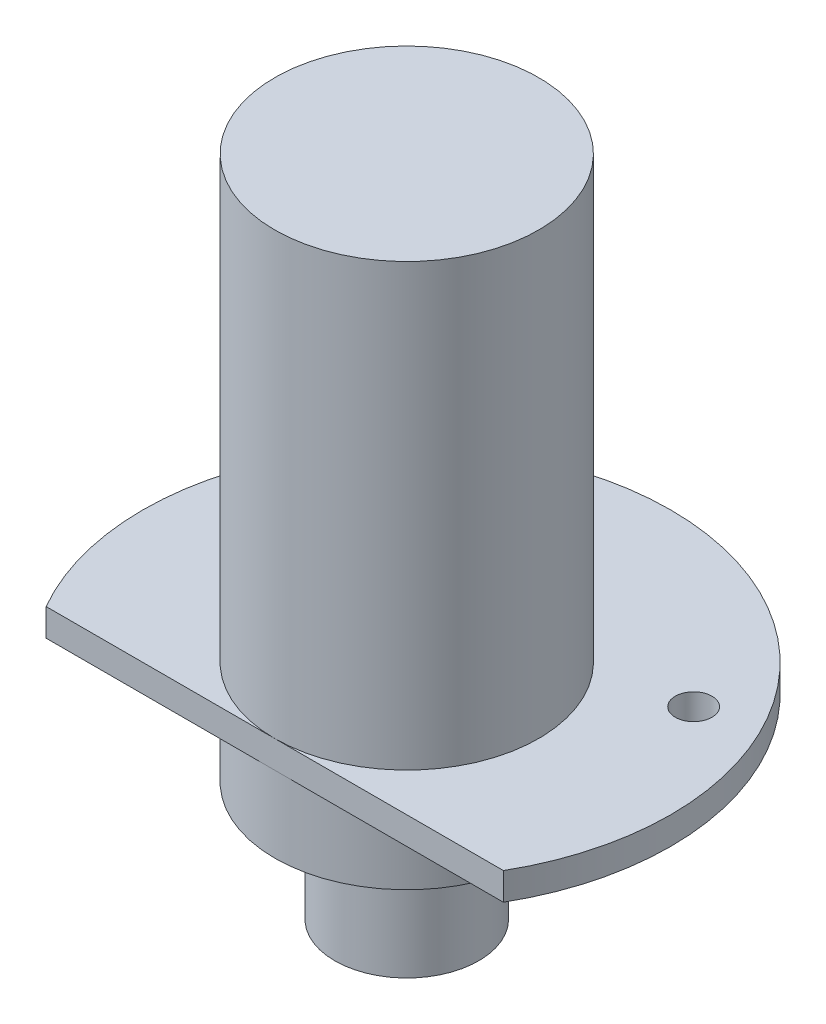
ISO-10303-21;
HEADER;
FILE_DESCRIPTION(('STEP AP214'),'2;1');
FILE_NAME('part.step','',(''),(''),'','','');
FILE_SCHEMA(('AUTOMOTIVE_DESIGN { 1 0 10303 214 1 1 1 1 }'));
ENDSEC;
DATA;
#1=APPLICATION_CONTEXT('core data for automotive mechanical design processes');
#2=APPLICATION_PROTOCOL_DEFINITION('international standard','automotive_design',2000,#1);
#3=PRODUCT_CONTEXT('',#1,'mechanical');
#4=PRODUCT('Part','Part','',(#3));
#5=PRODUCT_RELATED_PRODUCT_CATEGORY('part','',(#4));
#6=PRODUCT_DEFINITION_FORMATION('','',#4);
#7=PRODUCT_DEFINITION_CONTEXT('part definition',#1,'design');
#8=PRODUCT_DEFINITION('design','',#6,#7);
#9=PRODUCT_DEFINITION_SHAPE('','',#8);
#10=(LENGTH_UNIT() NAMED_UNIT(*) SI_UNIT(.MILLI.,.METRE.));
#11=(NAMED_UNIT(*) PLANE_ANGLE_UNIT() SI_UNIT($,.RADIAN.));
#12=(NAMED_UNIT(*) SI_UNIT($,.STERADIAN.) SOLID_ANGLE_UNIT());
#13=UNCERTAINTY_MEASURE_WITH_UNIT(LENGTH_MEASURE(1.E-05),#10,'distance_accuracy_value','');
#14=(GEOMETRIC_REPRESENTATION_CONTEXT(3) GLOBAL_UNCERTAINTY_ASSIGNED_CONTEXT((#13)) GLOBAL_UNIT_ASSIGNED_CONTEXT((#10,
#11,#12)) REPRESENTATION_CONTEXT('',''));
#15=CARTESIAN_POINT('',(0.,0.,0.));
#16=DIRECTION('',(0.,0.,1.));
#17=DIRECTION('',(1.,0.,0.));
#18=AXIS2_PLACEMENT_3D('',#15,#16,#17);
#19=CARTESIAN_POINT('',(0.,55.245,-10.999999971));
#20=DIRECTION('',(0.,-1.,0.));
#21=DIRECTION('',(0.,0.,-1.));
#22=AXIS2_PLACEMENT_3D('',#19,#20,#21);
#23=PLANE('',#22);
#24=CARTESIAN_POINT('',(0.,55.245,0.));
#25=DIRECTION('',(0.,1.,0.));
#26=DIRECTION('',(0.,0.,1.));
#27=AXIS2_PLACEMENT_3D('',#24,#25,#26);
#28=CIRCLE('',#27,10.999999971);
#29=CARTESIAN_POINT('',(0.,55.245,10.999999971));
#30=VERTEX_POINT('',#29);
#31=EDGE_CURVE('E11',#30,#30,#28,.T.);
#32=ORIENTED_EDGE('',*,*,#31,.T.);
#33=EDGE_LOOP('',(#32));
#34=FACE_BOUND('',#33,.T.);
#35=ADVANCED_FACE('F35',(#34),#23,.F.);
#36=CARTESIAN_POINT('',(0.,55.245,0.));
#37=DIRECTION('',(0.,1.,0.));
#38=DIRECTION('',(0.,0.,1.));
#39=AXIS2_PLACEMENT_3D('',#36,#37,#38);
#40=CYLINDRICAL_SURFACE('',#39,10.999999971);
#41=ORIENTED_EDGE('',*,*,#31,.F.);
#42=EDGE_LOOP('',(#41));
#43=FACE_BOUND('',#42,.T.);
#44=CARTESIAN_POINT('',(0.,18.542,0.));
#45=DIRECTION('',(0.,1.,0.));
#46=DIRECTION('',(0.,0.,1.));
#47=AXIS2_PLACEMENT_3D('',#44,#45,#46);
#48=CIRCLE('',#47,10.999999971);
#49=CARTESIAN_POINT('',(0.,18.542,10.999999971));
#50=VERTEX_POINT('',#49);
#51=EDGE_CURVE('E42',#50,#50,#48,.T.);
#52=ORIENTED_EDGE('',*,*,#51,.T.);
#53=EDGE_LOOP('',(#52));
#54=FACE_BOUND('',#53,.T.);
#55=ADVANCED_FACE('F147',(#43,#54),#40,.T.);
#56=CARTESIAN_POINT('',(0.,18.542,-10.999999971));
#57=DIRECTION('',(0.,-1.,0.));
#58=DIRECTION('',(0.,0.,-1.));
#59=AXIS2_PLACEMENT_3D('',#56,#57,#58);
#60=PLANE('',#59);
#61=CARTESIAN_POINT('',(15.155444611261,18.542,-8.750000026));
#62=DIRECTION('',(0.,-1.,0.));
#63=DIRECTION('',(0.,0.,-1.));
#64=AXIS2_PLACEMENT_3D('',#61,#62,#63);
#65=CIRCLE('',#64,1.526999994);
#66=CARTESIAN_POINT('',(15.155444611261,18.542,-10.27700002));
#67=VERTEX_POINT('',#66);
#68=EDGE_CURVE('E100',#67,#67,#65,.T.);
#69=ORIENTED_EDGE('',*,*,#68,.T.);
#70=EDGE_LOOP('',(#69));
#71=FACE_BOUND('',#70,.T.);
#72=CARTESIAN_POINT('',(-15.155444611261,18.542,-8.75000002600001));
#73=DIRECTION('',(0.,-1.,0.));
#74=DIRECTION('',(0.,0.,-1.));
#75=AXIS2_PLACEMENT_3D('',#72,#73,#74);
#76=CIRCLE('',#75,1.526999994);
#77=CARTESIAN_POINT('',(-15.155444611261,18.542,-10.27700002));
#78=VERTEX_POINT('',#77);
#79=EDGE_CURVE('E103',#78,#78,#76,.T.);
#80=ORIENTED_EDGE('',*,*,#79,.T.);
#81=EDGE_LOOP('',(#80));
#82=FACE_BOUND('',#81,.T.);
#83=CARTESIAN_POINT('',(0.,18.542,0.));
#84=DIRECTION('',(0.,1.,0.));
#85=DIRECTION('',(0.,0.,1.));
#86=AXIS2_PLACEMENT_3D('',#83,#84,#85);
#87=CIRCLE('',#86,21.999999942);
#88=CARTESIAN_POINT('',(19.0525588330282,18.542,10.999999971));
#89=VERTEX_POINT('',#88);
#90=CARTESIAN_POINT('',(-19.0525588330282,18.542,10.999999971));
#91=VERTEX_POINT('',#90);
#92=EDGE_CURVE('E78',#89,#91,#87,.T.);
#93=ORIENTED_EDGE('',*,*,#92,.T.);
#94=DIRECTION('',(1.,0.,0.));
#95=VECTOR('',#94,1.);
#96=CARTESIAN_POINT('',(0.,18.542,10.999999971));
#97=LINE('',#96,#95);
#98=EDGE_CURVE('E65',#91,#50,#97,.T.);
#99=ORIENTED_EDGE('',*,*,#98,.T.);
#100=ORIENTED_EDGE('',*,*,#51,.F.);
#101=EDGE_CURVE('E55',#50,#89,#97,.T.);
#102=ORIENTED_EDGE('',*,*,#101,.T.);
#103=EDGE_LOOP('',(#93,#99,#100,#102));
#104=FACE_BOUND('',#103,.T.);
#105=ADVANCED_FACE('F84',(#71,#82,#104),#60,.F.);
#106=CARTESIAN_POINT('',(0.,55.245,0.));
#107=DIRECTION('',(0.,1.,0.));
#108=DIRECTION('',(0.,0.,1.));
#109=AXIS2_PLACEMENT_3D('',#106,#107,#108);
#110=CYLINDRICAL_SURFACE('',#109,21.999999942);
#111=CARTESIAN_POINT('',(0.,16.256,0.));
#112=DIRECTION('',(0.,1.,0.));
#113=DIRECTION('',(0.,0.,1.));
#114=AXIS2_PLACEMENT_3D('',#111,#112,#113);
#115=CIRCLE('',#114,21.999999942);
#116=CARTESIAN_POINT('',(19.0525588330282,16.256,10.999999971));
#117=VERTEX_POINT('',#116);
#118=CARTESIAN_POINT('',(-19.0525588330282,16.256,10.999999971));
#119=VERTEX_POINT('',#118);
#120=EDGE_CURVE('E80',#117,#119,#115,.T.);
#121=ORIENTED_EDGE('',*,*,#120,.T.);
#122=DIRECTION('',(0.,1.,0.));
#123=VECTOR('',#122,1.);
#124=CARTESIAN_POINT('',(-19.0525588330282,0.,10.999999971));
#125=LINE('',#124,#123);
#126=EDGE_CURVE('E49',#119,#91,#125,.T.);
#127=ORIENTED_EDGE('',*,*,#126,.T.);
#128=ORIENTED_EDGE('',*,*,#92,.F.);
#129=DIRECTION('',(0.,1.,0.));
#130=VECTOR('',#129,1.);
#131=CARTESIAN_POINT('',(19.0525588330282,0.,10.999999971));
#132=LINE('',#131,#130);
#133=EDGE_CURVE('E82',#117,#89,#132,.T.);
#134=ORIENTED_EDGE('',*,*,#133,.F.);
#135=EDGE_LOOP('',(#121,#127,#128,#134));
#136=FACE_BOUND('',#135,.T.);
#137=ADVANCED_FACE('F76',(#136),#110,.T.);
#138=CARTESIAN_POINT('',(0.,16.256,-21.999999942));
#139=DIRECTION('',(0.,1.,0.));
#140=DIRECTION('',(0.,0.,1.));
#141=AXIS2_PLACEMENT_3D('',#138,#139,#140);
#142=PLANE('',#141);
#143=CARTESIAN_POINT('',(15.155444611261,16.256,-8.750000026));
#144=DIRECTION('',(0.,-1.,0.));
#145=DIRECTION('',(0.,0.,-1.));
#146=AXIS2_PLACEMENT_3D('',#143,#144,#145);
#147=CIRCLE('',#146,1.526999994);
#148=CARTESIAN_POINT('',(15.155444611261,16.256,-10.27700002));
#149=VERTEX_POINT('',#148);
#150=EDGE_CURVE('E106',#149,#149,#147,.T.);
#151=ORIENTED_EDGE('',*,*,#150,.F.);
#152=EDGE_LOOP('',(#151));
#153=FACE_BOUND('',#152,.T.);
#154=CARTESIAN_POINT('',(-15.155444611261,16.256,-8.75000002600001));
#155=DIRECTION('',(0.,-1.,0.));
#156=DIRECTION('',(0.,0.,-1.));
#157=AXIS2_PLACEMENT_3D('',#154,#155,#156);
#158=CIRCLE('',#157,1.526999994);
#159=CARTESIAN_POINT('',(-15.155444611261,16.256,-10.27700002));
#160=VERTEX_POINT('',#159);
#161=EDGE_CURVE('E71',#160,#160,#158,.T.);
#162=ORIENTED_EDGE('',*,*,#161,.F.);
#163=EDGE_LOOP('',(#162));
#164=FACE_BOUND('',#163,.T.);
#165=ORIENTED_EDGE('',*,*,#120,.F.);
#166=DIRECTION('',(-1.,0.,0.));
#167=VECTOR('',#166,1.);
#168=CARTESIAN_POINT('',(0.,16.256,10.999999971));
#169=LINE('',#168,#167);
#170=CARTESIAN_POINT('',(0.,16.256,10.999999971));
#171=VERTEX_POINT('',#170);
#172=EDGE_CURVE('E111',#117,#171,#169,.T.);
#173=ORIENTED_EDGE('',*,*,#172,.T.);
#174=CARTESIAN_POINT('',(0.,16.256,0.));
#175=DIRECTION('',(0.,1.,0.));
#176=DIRECTION('',(0.,0.,1.));
#177=AXIS2_PLACEMENT_3D('',#174,#175,#176);
#178=CIRCLE('',#177,10.999999971);
#179=EDGE_CURVE('E86',#171,#171,#178,.T.);
#180=ORIENTED_EDGE('',*,*,#179,.T.);
#181=EDGE_CURVE('E81',#171,#119,#169,.T.);
#182=ORIENTED_EDGE('',*,*,#181,.T.);
#183=EDGE_LOOP('',(#165,#173,#180,#182));
#184=FACE_BOUND('',#183,.T.);
#185=ADVANCED_FACE('F115',(#153,#164,#184),#142,.F.);
#186=CARTESIAN_POINT('',(0.,55.245,0.));
#187=DIRECTION('',(0.,1.,0.));
#188=DIRECTION('',(0.,0.,1.));
#189=AXIS2_PLACEMENT_3D('',#186,#187,#188);
#190=CYLINDRICAL_SURFACE('',#189,10.999999971);
#191=ORIENTED_EDGE('',*,*,#179,.F.);
#192=EDGE_LOOP('',(#191));
#193=FACE_BOUND('',#192,.T.);
#194=CARTESIAN_POINT('',(0.,9.906,0.));
#195=DIRECTION('',(0.,1.,0.));
#196=DIRECTION('',(0.,0.,1.));
#197=AXIS2_PLACEMENT_3D('',#194,#195,#196);
#198=CIRCLE('',#197,10.999999971);
#199=CARTESIAN_POINT('',(0.,9.906,10.999999971));
#200=VERTEX_POINT('',#199);
#201=EDGE_CURVE('E91',#200,#200,#198,.T.);
#202=ORIENTED_EDGE('',*,*,#201,.T.);
#203=EDGE_LOOP('',(#202));
#204=FACE_BOUND('',#203,.T.);
#205=ADVANCED_FACE('F118',(#193,#204),#190,.T.);
#206=CARTESIAN_POINT('',(0.,9.906,-10.999999971));
#207=DIRECTION('',(0.,1.,0.));
#208=DIRECTION('',(0.,0.,1.));
#209=AXIS2_PLACEMENT_3D('',#206,#207,#208);
#210=PLANE('',#209);
#211=ORIENTED_EDGE('',*,*,#201,.F.);
#212=EDGE_LOOP('',(#211));
#213=FACE_BOUND('',#212,.T.);
#214=CARTESIAN_POINT('',(0.,9.906,0.));
#215=DIRECTION('',(0.,1.,0.));
#216=DIRECTION('',(0.,0.,1.));
#217=AXIS2_PLACEMENT_3D('',#214,#215,#216);
#218=CIRCLE('',#217,5.99999993800001);
#219=CARTESIAN_POINT('',(0.,9.906,5.99999993800001));
#220=VERTEX_POINT('',#219);
#221=EDGE_CURVE('E94',#220,#220,#218,.T.);
#222=ORIENTED_EDGE('',*,*,#221,.T.);
#223=EDGE_LOOP('',(#222));
#224=FACE_BOUND('',#223,.T.);
#225=ADVANCED_FACE('F121',(#213,#224),#210,.F.);
#226=CARTESIAN_POINT('',(0.,55.245,0.));
#227=DIRECTION('',(0.,1.,0.));
#228=DIRECTION('',(0.,0.,1.));
#229=AXIS2_PLACEMENT_3D('',#226,#227,#228);
#230=CYLINDRICAL_SURFACE('',#229,5.999999938);
#231=ORIENTED_EDGE('',*,*,#221,.F.);
#232=EDGE_LOOP('',(#231));
#233=FACE_BOUND('',#232,.T.);
#234=CARTESIAN_POINT('',(0.,0.,0.));
#235=DIRECTION('',(0.,1.,0.));
#236=DIRECTION('',(0.,0.,1.));
#237=AXIS2_PLACEMENT_3D('',#234,#235,#236);
#238=CIRCLE('',#237,5.999999938);
#239=CARTESIAN_POINT('',(0.,0.,5.999999938));
#240=VERTEX_POINT('',#239);
#241=EDGE_CURVE('E97',#240,#240,#238,.T.);
#242=ORIENTED_EDGE('',*,*,#241,.T.);
#243=EDGE_LOOP('',(#242));
#244=FACE_BOUND('',#243,.T.);
#245=ADVANCED_FACE('F127',(#233,#244),#230,.T.);
#246=CARTESIAN_POINT('',(0.,0.,-5.999999938));
#247=DIRECTION('',(0.,1.,0.));
#248=DIRECTION('',(0.,0.,1.));
#249=AXIS2_PLACEMENT_3D('',#246,#247,#248);
#250=PLANE('',#249);
#251=ORIENTED_EDGE('',*,*,#241,.F.);
#252=EDGE_LOOP('',(#251));
#253=FACE_BOUND('',#252,.T.);
#254=ADVANCED_FACE('F133',(#253),#250,.F.);
#255=CARTESIAN_POINT('',(-15.155444611261,55.245,-8.75000002600001));
#256=DIRECTION('',(0.,-1.,0.));
#257=DIRECTION('',(0.,0.,-1.));
#258=AXIS2_PLACEMENT_3D('',#255,#256,#257);
#259=CYLINDRICAL_SURFACE('',#258,1.526999994);
#260=ORIENTED_EDGE('',*,*,#161,.T.);
#261=EDGE_LOOP('',(#260));
#262=FACE_BOUND('',#261,.T.);
#263=ORIENTED_EDGE('',*,*,#79,.F.);
#264=EDGE_LOOP('',(#263));
#265=FACE_BOUND('',#264,.T.);
#266=ADVANCED_FACE('F138',(#262,#265),#259,.F.);
#267=CARTESIAN_POINT('',(15.155444611261,55.245,-8.750000026));
#268=DIRECTION('',(0.,-1.,0.));
#269=DIRECTION('',(0.,0.,-1.));
#270=AXIS2_PLACEMENT_3D('',#267,#268,#269);
#271=CYLINDRICAL_SURFACE('',#270,1.526999994);
#272=ORIENTED_EDGE('',*,*,#150,.T.);
#273=EDGE_LOOP('',(#272));
#274=FACE_BOUND('',#273,.T.);
#275=ORIENTED_EDGE('',*,*,#68,.F.);
#276=EDGE_LOOP('',(#275));
#277=FACE_BOUND('',#276,.T.);
#278=ADVANCED_FACE('F143',(#274,#277),#271,.F.);
#279=CARTESIAN_POINT('',(-19.0525588330282,0.,10.999999971));
#280=DIRECTION('',(0.,0.,-1.));
#281=DIRECTION('',(0.,1.,0.));
#282=AXIS2_PLACEMENT_3D('',#279,#280,#281);
#283=PLANE('',#282);
#284=ORIENTED_EDGE('',*,*,#126,.F.);
#285=ORIENTED_EDGE('',*,*,#181,.F.);
#286=ORIENTED_EDGE('',*,*,#172,.F.);
#287=ORIENTED_EDGE('',*,*,#133,.T.);
#288=ORIENTED_EDGE('',*,*,#101,.F.);
#289=ORIENTED_EDGE('',*,*,#98,.F.);
#290=EDGE_LOOP('',(#284,#285,#286,#287,#288,#289));
#291=FACE_BOUND('',#290,.T.);
#292=ADVANCED_FACE('F66',(#291),#283,.F.);
#293=CLOSED_SHELL('',(#35,#55,#105,#137,#185,#205,#225,#245,#254,#266,#278,#292));
#294=MANIFOLD_SOLID_BREP('B2',#293);
#295=ADVANCED_BREP_SHAPE_REPRESENTATION('',(#18,#294),#14);
#296=SHAPE_DEFINITION_REPRESENTATION(#9,#295);
ENDSEC;
END-ISO-10303-21;
